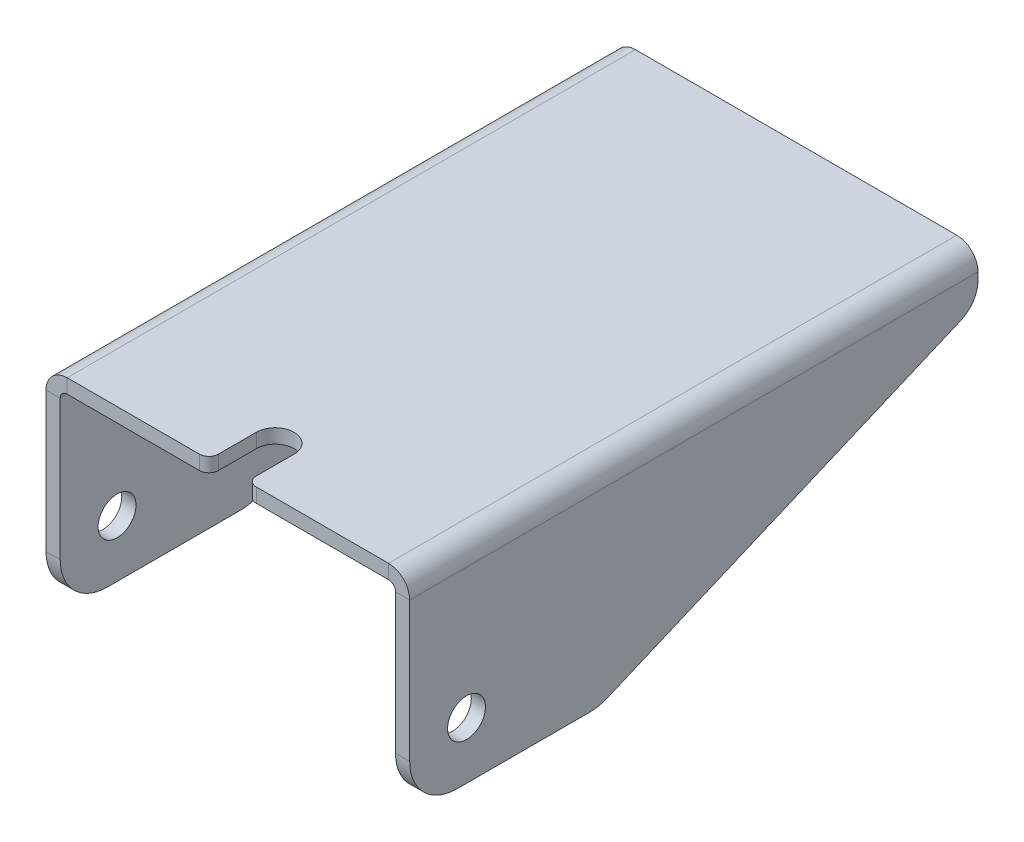
ISO-10303-21;
HEADER;
FILE_DESCRIPTION(('STEP AP214'),'2;1');
FILE_NAME('part.step','',(''),(''),'','','');
FILE_SCHEMA(('AUTOMOTIVE_DESIGN { 1 0 10303 214 1 1 1 1 }'));
ENDSEC;
DATA;
#1=APPLICATION_CONTEXT('core data for automotive mechanical design processes');
#2=APPLICATION_PROTOCOL_DEFINITION('international standard','automotive_design',2000,#1);
#3=PRODUCT_CONTEXT('',#1,'mechanical');
#4=PRODUCT('Part','Part','',(#3));
#5=PRODUCT_RELATED_PRODUCT_CATEGORY('part','',(#4));
#6=PRODUCT_DEFINITION_FORMATION('','',#4);
#7=PRODUCT_DEFINITION_CONTEXT('part definition',#1,'design');
#8=PRODUCT_DEFINITION('design','',#6,#7);
#9=PRODUCT_DEFINITION_SHAPE('','',#8);
#10=(LENGTH_UNIT() NAMED_UNIT(*) SI_UNIT(.MILLI.,.METRE.));
#11=(NAMED_UNIT(*) PLANE_ANGLE_UNIT() SI_UNIT($,.RADIAN.));
#12=(NAMED_UNIT(*) SI_UNIT($,.STERADIAN.) SOLID_ANGLE_UNIT());
#13=UNCERTAINTY_MEASURE_WITH_UNIT(LENGTH_MEASURE(1.E-05),#10,'distance_accuracy_value','');
#14=(GEOMETRIC_REPRESENTATION_CONTEXT(3) GLOBAL_UNCERTAINTY_ASSIGNED_CONTEXT((#13)) GLOBAL_UNIT_ASSIGNED_CONTEXT((#10,
#11,#12)) REPRESENTATION_CONTEXT('',''));
#15=CARTESIAN_POINT('',(0.,0.,0.));
#16=DIRECTION('',(0.,0.,1.));
#17=DIRECTION('',(1.,0.,0.));
#18=AXIS2_PLACEMENT_3D('',#15,#16,#17);
#19=CARTESIAN_POINT('',(-17.7,-1.5,60.));
#20=DIRECTION('',(0.,0.,1.));
#21=DIRECTION('',(1.,0.,0.));
#22=AXIS2_PLACEMENT_3D('',#19,#20,#21);
#23=PLANE('',#22);
#24=DIRECTION('',(1.,0.,0.));
#25=VECTOR('',#24,1.);
#26=CARTESIAN_POINT('',(-17.7,0.,60.));
#27=LINE('',#26,#25);
#28=CARTESIAN_POINT('',(2.99999999999999,0.,60.));
#29=VERTEX_POINT('',#28);
#30=CARTESIAN_POINT('',(16.9634,0.,60.));
#31=VERTEX_POINT('',#30);
#32=EDGE_CURVE('E412',#29,#31,#27,.T.);
#33=ORIENTED_EDGE('',*,*,#32,.F.);
#34=DIRECTION('',(0.,1.,0.));
#35=VECTOR('',#34,1.);
#36=CARTESIAN_POINT('',(2.99999999999999,-1.5,60.));
#37=LINE('',#36,#35);
#38=CARTESIAN_POINT('',(2.99999999999999,-1.5,60.));
#39=VERTEX_POINT('',#38);
#40=EDGE_CURVE('E11',#29,#39,#37,.F.);
#41=ORIENTED_EDGE('',*,*,#40,.T.);
#42=DIRECTION('',(1.,0.,0.));
#43=VECTOR('',#42,1.);
#44=CARTESIAN_POINT('',(-17.7,-1.5,60.));
#45=LINE('',#44,#43);
#46=CARTESIAN_POINT('',(16.9634,-1.5,60.));
#47=VERTEX_POINT('',#46);
#48=EDGE_CURVE('E404',#39,#47,#45,.T.);
#49=ORIENTED_EDGE('',*,*,#48,.T.);
#50=DIRECTION('',(0.,1.,0.));
#51=VECTOR('',#50,1.);
#52=CARTESIAN_POINT('',(16.9634,-1.5,60.));
#53=LINE('',#52,#51);
#54=EDGE_CURVE('E305',#47,#31,#53,.T.);
#55=ORIENTED_EDGE('',*,*,#54,.T.);
#56=EDGE_LOOP('',(#33,#41,#49,#55));
#57=FACE_BOUND('',#56,.T.);
#58=ADVANCED_FACE('F41',(#57),#23,.T.);
#59=CARTESIAN_POINT('',(-19.2000000000001,-22.,0.));
#60=DIRECTION('',(0.,0.,1.));
#61=DIRECTION('',(1.,0.,0.));
#62=AXIS2_PLACEMENT_3D('',#59,#60,#61);
#63=PLANE('',#62);
#64=DIRECTION('',(0.,-1.,0.));
#65=VECTOR('',#64,1.);
#66=CARTESIAN_POINT('',(-17.7000000000001,-22.,0.));
#67=LINE('',#66,#65);
#68=CARTESIAN_POINT('',(-17.7,-2.2366,0.));
#69=VERTEX_POINT('',#68);
#70=CARTESIAN_POINT('',(-17.7,-3.01530292818484,0.));
#71=VERTEX_POINT('',#70);
#72=EDGE_CURVE('E361',#69,#71,#67,.T.);
#73=ORIENTED_EDGE('',*,*,#72,.T.);
#74=DIRECTION('',(-1.,0.,0.));
#75=VECTOR('',#74,1.);
#76=CARTESIAN_POINT('',(-19.2,-3.01530292818482,0.));
#77=LINE('',#76,#75);
#78=CARTESIAN_POINT('',(-19.2,-3.01530292818483,0.));
#79=VERTEX_POINT('',#78);
#80=EDGE_CURVE('E432',#71,#79,#77,.T.);
#81=ORIENTED_EDGE('',*,*,#80,.T.);
#82=DIRECTION('',(0.,-1.,0.));
#83=VECTOR('',#82,1.);
#84=CARTESIAN_POINT('',(-19.2000000000001,-22.,0.));
#85=LINE('',#84,#83);
#86=CARTESIAN_POINT('',(-19.2,-2.23659999999999,0.));
#87=VERTEX_POINT('',#86);
#88=EDGE_CURVE('E362',#87,#79,#85,.T.);
#89=ORIENTED_EDGE('',*,*,#88,.F.);
#90=DIRECTION('',(-1.,0.,0.));
#91=VECTOR('',#90,1.);
#92=CARTESIAN_POINT('',(-17.7,-2.2366,0.));
#93=LINE('',#92,#91);
#94=EDGE_CURVE('E353',#69,#87,#93,.T.);
#95=ORIENTED_EDGE('',*,*,#94,.F.);
#96=EDGE_LOOP('',(#73,#81,#89,#95));
#97=FACE_BOUND('',#96,.T.);
#98=ADVANCED_FACE('F466',(#97),#63,.F.);
#99=CARTESIAN_POINT('',(-19.2,0.,0.));
#100=DIRECTION('',(1.,0.,0.));
#101=DIRECTION('',(0.,1.,0.));
#102=AXIS2_PLACEMENT_3D('',#99,#100,#101);
#103=PLANE('',#102);
#104=CARTESIAN_POINT('',(-19.2,-16.,54.));
#105=DIRECTION('',(-1.,0.,0.));
#106=DIRECTION('',(0.,-1.,0.));
#107=AXIS2_PLACEMENT_3D('',#104,#105,#106);
#108=CIRCLE('',#107,2.);
#109=CARTESIAN_POINT('',(-19.2,-18.,54.));
#110=VERTEX_POINT('',#109);
#111=EDGE_CURVE('E340',#110,#110,#108,.T.);
#112=ORIENTED_EDGE('',*,*,#111,.F.);
#113=EDGE_LOOP('',(#112));
#114=FACE_BOUND('',#113,.T.);
#115=ORIENTED_EDGE('',*,*,#88,.T.);
#116=CARTESIAN_POINT('',(-19.2,-3.01530292818483,3.));
#117=DIRECTION('',(1.,0.,0.));
#118=DIRECTION('',(0.,1.,0.));
#119=AXIS2_PLACEMENT_3D('',#116,#117,#118);
#120=CIRCLE('',#119,3.);
#121=CARTESIAN_POINT('',(-19.2,-5.77629568356025,1.82657807896544));
#122=VERTEX_POINT('',#121);
#123=EDGE_CURVE('E435',#79,#122,#120,.F.);
#124=ORIENTED_EDGE('',*,*,#123,.T.);
#125=DIRECTION('',(0.,-0.391140640344853,0.920330918458474));
#126=VECTOR('',#125,1.);
#127=CARTESIAN_POINT('',(-19.2,-4.99999999999993,0.));
#128=LINE('',#127,#126);
#129=CARTESIAN_POINT('',(-19.2000000000001,-21.6016545922924,39.0627166877468));
#130=VERTEX_POINT('',#129);
#131=EDGE_CURVE('E346',#122,#130,#128,.T.);
#132=ORIENTED_EDGE('',*,*,#131,.T.);
#133=CARTESIAN_POINT('',(-19.2,-17.,41.018419889471));
#134=DIRECTION('',(1.,0.,0.));
#135=DIRECTION('',(0.,1.,0.));
#136=AXIS2_PLACEMENT_3D('',#133,#134,#135);
#137=CIRCLE('',#136,5.);
#138=CARTESIAN_POINT('',(-19.2000000000001,-22.,41.018419889471));
#139=VERTEX_POINT('',#138);
#140=EDGE_CURVE('E418',#130,#139,#137,.F.);
#141=ORIENTED_EDGE('',*,*,#140,.T.);
#142=DIRECTION('',(0.,0.,1.));
#143=VECTOR('',#142,1.);
#144=CARTESIAN_POINT('',(-19.2000000000001,-22.,60.));
#145=LINE('',#144,#143);
#146=CARTESIAN_POINT('',(-19.2000000000001,-22.,55.));
#147=VERTEX_POINT('',#146);
#148=EDGE_CURVE('E365',#139,#147,#145,.T.);
#149=ORIENTED_EDGE('',*,*,#148,.T.);
#150=CARTESIAN_POINT('',(-19.2,-17.,55.));
#151=DIRECTION('',(1.,0.,0.));
#152=DIRECTION('',(0.,1.,0.));
#153=AXIS2_PLACEMENT_3D('',#150,#151,#152);
#154=CIRCLE('',#153,5.);
#155=CARTESIAN_POINT('',(-19.2,-17.,60.));
#156=VERTEX_POINT('',#155);
#157=EDGE_CURVE('E416',#147,#156,#154,.F.);
#158=ORIENTED_EDGE('',*,*,#157,.T.);
#159=DIRECTION('',(0.,1.,0.));
#160=VECTOR('',#159,1.);
#161=CARTESIAN_POINT('',(-19.2,-1.49999999999999,60.));
#162=LINE('',#161,#160);
#163=CARTESIAN_POINT('',(-19.2,-2.23659999999999,60.));
#164=VERTEX_POINT('',#163);
#165=EDGE_CURVE('E369',#156,#164,#162,.T.);
#166=ORIENTED_EDGE('',*,*,#165,.T.);
#167=DIRECTION('',(0.,0.,1.));
#168=VECTOR('',#167,1.);
#169=CARTESIAN_POINT('',(-19.2,-2.23659999999999,0.));
#170=LINE('',#169,#168);
#171=EDGE_CURVE('E356',#87,#164,#170,.T.);
#172=ORIENTED_EDGE('',*,*,#171,.F.);
#173=EDGE_LOOP('',(#115,#124,#132,#141,#149,#158,#166,#172));
#174=FACE_BOUND('',#173,.T.);
#175=ADVANCED_FACE('F472',(#114,#174),#103,.F.);
#176=CARTESIAN_POINT('',(-17.7,0.,0.));
#177=DIRECTION('',(1.,0.,0.));
#178=DIRECTION('',(0.,1.,0.));
#179=AXIS2_PLACEMENT_3D('',#176,#177,#178);
#180=PLANE('',#179);
#181=CARTESIAN_POINT('',(-17.7,-16.,54.));
#182=DIRECTION('',(1.,0.,0.));
#183=DIRECTION('',(0.,1.,0.));
#184=AXIS2_PLACEMENT_3D('',#181,#182,#183);
#185=CIRCLE('',#184,2.);
#186=CARTESIAN_POINT('',(-17.7,-14.,54.));
#187=VERTEX_POINT('',#186);
#188=EDGE_CURVE('E343',#187,#187,#185,.F.);
#189=ORIENTED_EDGE('',*,*,#188,.T.);
#190=EDGE_LOOP('',(#189));
#191=FACE_BOUND('',#190,.T.);
#192=DIRECTION('',(0.,-0.391140640344853,0.920330918458474));
#193=VECTOR('',#192,1.);
#194=CARTESIAN_POINT('',(-17.7,-4.99999999999994,0.));
#195=LINE('',#194,#193);
#196=CARTESIAN_POINT('',(-17.7,-5.77629568356025,1.82657807896544));
#197=VERTEX_POINT('',#196);
#198=CARTESIAN_POINT('',(-17.7000000000001,-21.6016545922924,39.0627166877468));
#199=VERTEX_POINT('',#198);
#200=EDGE_CURVE('E348',#197,#199,#195,.T.);
#201=ORIENTED_EDGE('',*,*,#200,.F.);
#202=CARTESIAN_POINT('',(-17.7,-3.01530292818483,3.));
#203=DIRECTION('',(1.,0.,0.));
#204=DIRECTION('',(0.,1.,0.));
#205=AXIS2_PLACEMENT_3D('',#202,#203,#204);
#206=CIRCLE('',#205,3.);
#207=EDGE_CURVE('E439',#197,#71,#206,.T.);
#208=ORIENTED_EDGE('',*,*,#207,.T.);
#209=ORIENTED_EDGE('',*,*,#72,.F.);
#210=DIRECTION('',(0.,0.,-1.));
#211=VECTOR('',#210,1.);
#212=CARTESIAN_POINT('',(-17.7,-2.2366,60.));
#213=LINE('',#212,#211);
#214=CARTESIAN_POINT('',(-17.7,-2.2366,60.));
#215=VERTEX_POINT('',#214);
#216=EDGE_CURVE('E351',#215,#69,#213,.T.);
#217=ORIENTED_EDGE('',*,*,#216,.F.);
#218=DIRECTION('',(0.,1.,0.));
#219=VECTOR('',#218,1.);
#220=CARTESIAN_POINT('',(-17.7,-1.5,60.));
#221=LINE('',#220,#219);
#222=CARTESIAN_POINT('',(-17.7,-17.,60.));
#223=VERTEX_POINT('',#222);
#224=EDGE_CURVE('E366',#223,#215,#221,.T.);
#225=ORIENTED_EDGE('',*,*,#224,.F.);
#226=CARTESIAN_POINT('',(-17.7,-17.,55.));
#227=DIRECTION('',(1.,0.,0.));
#228=DIRECTION('',(0.,1.,0.));
#229=AXIS2_PLACEMENT_3D('',#226,#227,#228);
#230=CIRCLE('',#229,5.);
#231=CARTESIAN_POINT('',(-17.7000000000001,-22.,55.));
#232=VERTEX_POINT('',#231);
#233=EDGE_CURVE('E424',#223,#232,#230,.T.);
#234=ORIENTED_EDGE('',*,*,#233,.T.);
#235=DIRECTION('',(0.,0.,1.));
#236=VECTOR('',#235,1.);
#237=CARTESIAN_POINT('',(-17.7000000000001,-22.,60.));
#238=LINE('',#237,#236);
#239=CARTESIAN_POINT('',(-17.7000000000001,-22.,41.018419889471));
#240=VERTEX_POINT('',#239);
#241=EDGE_CURVE('E374',#240,#232,#238,.T.);
#242=ORIENTED_EDGE('',*,*,#241,.F.);
#243=CARTESIAN_POINT('',(-17.7,-17.,41.018419889471));
#244=DIRECTION('',(1.,0.,0.));
#245=DIRECTION('',(0.,1.,0.));
#246=AXIS2_PLACEMENT_3D('',#243,#244,#245);
#247=CIRCLE('',#246,5.);
#248=EDGE_CURVE('E426',#240,#199,#247,.T.);
#249=ORIENTED_EDGE('',*,*,#248,.T.);
#250=EDGE_LOOP('',(#201,#208,#209,#217,#225,#234,#242,#249));
#251=FACE_BOUND('',#250,.T.);
#252=ADVANCED_FACE('F518',(#191,#251),#180,.T.);
#253=CARTESIAN_POINT('',(-19.2000000000001,-22.,60.));
#254=DIRECTION('',(0.,1.,0.));
#255=DIRECTION('',(-1.,0.,0.));
#256=AXIS2_PLACEMENT_3D('',#253,#254,#255);
#257=PLANE('',#256);
#258=ORIENTED_EDGE('',*,*,#148,.F.);
#259=DIRECTION('',(-1.,0.,0.));
#260=VECTOR('',#259,1.);
#261=CARTESIAN_POINT('',(-17.7000000000001,-22.,41.018419889471));
#262=LINE('',#261,#260);
#263=EDGE_CURVE('E422',#139,#240,#262,.F.);
#264=ORIENTED_EDGE('',*,*,#263,.T.);
#265=ORIENTED_EDGE('',*,*,#241,.T.);
#266=DIRECTION('',(1.,0.,0.));
#267=VECTOR('',#266,1.);
#268=CARTESIAN_POINT('',(-19.2000000000001,-22.,55.));
#269=LINE('',#268,#267);
#270=EDGE_CURVE('E420',#232,#147,#269,.F.);
#271=ORIENTED_EDGE('',*,*,#270,.T.);
#272=EDGE_LOOP('',(#258,#264,#265,#271));
#273=FACE_BOUND('',#272,.T.);
#274=ADVANCED_FACE('F501',(#273),#257,.F.);
#275=CARTESIAN_POINT('',(0.,-1.5,0.));
#276=DIRECTION('',(0.,0.,-1.));
#277=DIRECTION('',(-1.,0.,0.));
#278=AXIS2_PLACEMENT_3D('',#275,#276,#277);
#279=PLANE('',#278);
#280=DIRECTION('',(-1.,0.,0.));
#281=VECTOR('',#280,1.);
#282=CARTESIAN_POINT('',(0.,-1.5,0.));
#283=LINE('',#282,#281);
#284=CARTESIAN_POINT('',(16.9634,-1.5,0.));
#285=VERTEX_POINT('',#284);
#286=CARTESIAN_POINT('',(-16.9634,-1.5,0.));
#287=VERTEX_POINT('',#286);
#288=EDGE_CURVE('E401',#285,#287,#283,.T.);
#289=ORIENTED_EDGE('',*,*,#288,.T.);
#290=DIRECTION('',(0.,1.,0.));
#291=VECTOR('',#290,1.);
#292=CARTESIAN_POINT('',(-16.9634,-1.5,0.));
#293=LINE('',#292,#291);
#294=CARTESIAN_POINT('',(-16.9634,0.,0.));
#295=VERTEX_POINT('',#294);
#296=EDGE_CURVE('E385',#287,#295,#293,.T.);
#297=ORIENTED_EDGE('',*,*,#296,.T.);
#298=DIRECTION('',(-1.,0.,0.));
#299=VECTOR('',#298,1.);
#300=CARTESIAN_POINT('',(0.,0.,0.));
#301=LINE('',#300,#299);
#302=CARTESIAN_POINT('',(16.9634,0.,0.));
#303=VERTEX_POINT('',#302);
#304=EDGE_CURVE('E398',#303,#295,#301,.T.);
#305=ORIENTED_EDGE('',*,*,#304,.F.);
#306=DIRECTION('',(0.,1.,0.));
#307=VECTOR('',#306,1.);
#308=CARTESIAN_POINT('',(16.9634,-1.5,0.));
#309=LINE('',#308,#307);
#310=EDGE_CURVE('E295',#285,#303,#309,.T.);
#311=ORIENTED_EDGE('',*,*,#310,.F.);
#312=EDGE_LOOP('',(#289,#297,#305,#311));
#313=FACE_BOUND('',#312,.T.);
#314=ADVANCED_FACE('F496',(#313),#279,.T.);
#315=CARTESIAN_POINT('',(0.,-1.5,0.));
#316=DIRECTION('',(0.,1.,0.));
#317=DIRECTION('',(0.,0.,1.));
#318=AXIS2_PLACEMENT_3D('',#315,#316,#317);
#319=PLANE('',#318);
#320=DIRECTION('',(0.,0.,-1.));
#321=VECTOR('',#320,1.);
#322=CARTESIAN_POINT('',(-1.99999999999999,-1.5,55.));
#323=LINE('',#322,#321);
#324=CARTESIAN_POINT('',(-1.99999999999999,-1.5,59.));
#325=VERTEX_POINT('',#324);
#326=CARTESIAN_POINT('',(-1.99999999999999,-1.5,55.));
#327=VERTEX_POINT('',#326);
#328=EDGE_CURVE('E221',#325,#327,#323,.T.);
#329=ORIENTED_EDGE('',*,*,#328,.F.);
#330=CARTESIAN_POINT('',(-2.99999999999999,-1.5,59.));
#331=DIRECTION('',(0.,1.,0.));
#332=DIRECTION('',(0.,0.,1.));
#333=AXIS2_PLACEMENT_3D('',#330,#331,#332);
#334=CIRCLE('',#333,1.);
#335=CARTESIAN_POINT('',(-2.99999999999999,-1.5,60.));
#336=VERTEX_POINT('',#335);
#337=EDGE_CURVE('E450',#325,#336,#334,.F.);
#338=ORIENTED_EDGE('',*,*,#337,.T.);
#339=CARTESIAN_POINT('',(-16.9634,-1.5,60.));
#340=VERTEX_POINT('',#339);
#341=EDGE_CURVE('E406',#340,#336,#45,.T.);
#342=ORIENTED_EDGE('',*,*,#341,.F.);
#343=DIRECTION('',(0.,0.,-1.));
#344=VECTOR('',#343,1.);
#345=CARTESIAN_POINT('',(-16.9634,-1.5,0.));
#346=LINE('',#345,#344);
#347=EDGE_CURVE('E391',#287,#340,#346,.F.);
#348=ORIENTED_EDGE('',*,*,#347,.F.);
#349=ORIENTED_EDGE('',*,*,#288,.F.);
#350=DIRECTION('',(0.,0.,-1.));
#351=VECTOR('',#350,1.);
#352=CARTESIAN_POINT('',(16.9634,-1.5,0.));
#353=LINE('',#352,#351);
#354=EDGE_CURVE('E300',#285,#47,#353,.F.);
#355=ORIENTED_EDGE('',*,*,#354,.T.);
#356=ORIENTED_EDGE('',*,*,#48,.F.);
#357=CARTESIAN_POINT('',(2.99999999999999,-1.5,59.));
#358=DIRECTION('',(0.,1.,0.));
#359=DIRECTION('',(0.,0.,1.));
#360=AXIS2_PLACEMENT_3D('',#357,#358,#359);
#361=CIRCLE('',#360,1.);
#362=CARTESIAN_POINT('',(1.99999999999999,-1.5,59.));
#363=VERTEX_POINT('',#362);
#364=EDGE_CURVE('E56',#39,#363,#361,.F.);
#365=ORIENTED_EDGE('',*,*,#364,.T.);
#366=DIRECTION('',(0.,0.,1.));
#367=VECTOR('',#366,1.);
#368=CARTESIAN_POINT('',(1.99999999999999,-1.5,55.));
#369=LINE('',#368,#367);
#370=CARTESIAN_POINT('',(1.99999999999999,-1.5,55.));
#371=VERTEX_POINT('',#370);
#372=EDGE_CURVE('E242',#371,#363,#369,.T.);
#373=ORIENTED_EDGE('',*,*,#372,.F.);
#374=CARTESIAN_POINT('',(0.,-1.5,55.));
#375=DIRECTION('',(0.,1.,0.));
#376=DIRECTION('',(0.,0.,1.));
#377=AXIS2_PLACEMENT_3D('',#374,#375,#376);
#378=CIRCLE('',#377,1.99999999999999);
#379=EDGE_CURVE('E246',#327,#371,#378,.F.);
#380=ORIENTED_EDGE('',*,*,#379,.F.);
#381=EDGE_LOOP('',(#329,#338,#342,#348,#349,#355,#356,#365,#373,#380));
#382=FACE_BOUND('',#381,.T.);
#383=ADVANCED_FACE('F487',(#382),#319,.F.);
#384=CARTESIAN_POINT('',(0.,0.,0.));
#385=DIRECTION('',(0.,1.,0.));
#386=DIRECTION('',(0.,0.,1.));
#387=AXIS2_PLACEMENT_3D('',#384,#385,#386);
#388=PLANE('',#387);
#389=CARTESIAN_POINT('',(-16.9634,0.,60.));
#390=VERTEX_POINT('',#389);
#391=CARTESIAN_POINT('',(-2.99999999999999,0.,60.));
#392=VERTEX_POINT('',#391);
#393=EDGE_CURVE('E405',#390,#392,#27,.T.);
#394=ORIENTED_EDGE('',*,*,#393,.T.);
#395=CARTESIAN_POINT('',(-2.99999999999999,0.,59.));
#396=DIRECTION('',(0.,1.,0.));
#397=DIRECTION('',(0.,0.,1.));
#398=AXIS2_PLACEMENT_3D('',#395,#396,#397);
#399=CIRCLE('',#398,1.);
#400=CARTESIAN_POINT('',(-1.99999999999999,0.,59.));
#401=VERTEX_POINT('',#400);
#402=EDGE_CURVE('E237',#392,#401,#399,.T.);
#403=ORIENTED_EDGE('',*,*,#402,.T.);
#404=DIRECTION('',(0.,0.,1.));
#405=VECTOR('',#404,1.);
#406=CARTESIAN_POINT('',(-1.99999999999999,0.,55.));
#407=LINE('',#406,#405);
#408=CARTESIAN_POINT('',(-1.99999999999999,0.,55.));
#409=VERTEX_POINT('',#408);
#410=EDGE_CURVE('E218',#409,#401,#407,.T.);
#411=ORIENTED_EDGE('',*,*,#410,.F.);
#412=CARTESIAN_POINT('',(0.,0.,55.));
#413=DIRECTION('',(0.,1.,0.));
#414=DIRECTION('',(0.,0.,1.));
#415=AXIS2_PLACEMENT_3D('',#412,#413,#414);
#416=CIRCLE('',#415,1.99999999999999);
#417=CARTESIAN_POINT('',(1.99999999999999,0.,55.));
#418=VERTEX_POINT('',#417);
#419=EDGE_CURVE('E229',#418,#409,#416,.T.);
#420=ORIENTED_EDGE('',*,*,#419,.F.);
#421=DIRECTION('',(0.,0.,-1.));
#422=VECTOR('',#421,1.);
#423=CARTESIAN_POINT('',(1.99999999999999,0.,55.));
#424=LINE('',#423,#422);
#425=CARTESIAN_POINT('',(1.99999999999999,0.,59.));
#426=VERTEX_POINT('',#425);
#427=EDGE_CURVE('E225',#426,#418,#424,.T.);
#428=ORIENTED_EDGE('',*,*,#427,.F.);
#429=CARTESIAN_POINT('',(2.99999999999999,0.,59.));
#430=DIRECTION('',(0.,1.,0.));
#431=DIRECTION('',(0.,0.,1.));
#432=AXIS2_PLACEMENT_3D('',#429,#430,#431);
#433=CIRCLE('',#432,1.);
#434=EDGE_CURVE('E444',#426,#29,#433,.T.);
#435=ORIENTED_EDGE('',*,*,#434,.T.);
#436=ORIENTED_EDGE('',*,*,#32,.T.);
#437=DIRECTION('',(0.,0.,-1.));
#438=VECTOR('',#437,1.);
#439=CARTESIAN_POINT('',(16.9634,0.,0.));
#440=LINE('',#439,#438);
#441=EDGE_CURVE('E289',#303,#31,#440,.F.);
#442=ORIENTED_EDGE('',*,*,#441,.F.);
#443=ORIENTED_EDGE('',*,*,#304,.T.);
#444=DIRECTION('',(0.,0.,-1.));
#445=VECTOR('',#444,1.);
#446=CARTESIAN_POINT('',(-16.9634,0.,0.));
#447=LINE('',#446,#445);
#448=EDGE_CURVE('E378',#295,#390,#447,.F.);
#449=ORIENTED_EDGE('',*,*,#448,.T.);
#450=EDGE_LOOP('',(#394,#403,#411,#420,#428,#435,#436,#442,#443,#449));
#451=FACE_BOUND('',#450,.T.);
#452=ADVANCED_FACE('F236',(#451),#388,.T.);
#453=ORIENTED_EDGE('',*,*,#341,.T.);
#454=DIRECTION('',(0.,1.,0.));
#455=VECTOR('',#454,1.);
#456=CARTESIAN_POINT('',(-2.99999999999999,0.,60.));
#457=LINE('',#456,#455);
#458=EDGE_CURVE('E441',#336,#392,#457,.T.);
#459=ORIENTED_EDGE('',*,*,#458,.T.);
#460=ORIENTED_EDGE('',*,*,#393,.F.);
#461=DIRECTION('',(0.,1.,0.));
#462=VECTOR('',#461,1.);
#463=CARTESIAN_POINT('',(-16.9634,-1.5,60.));
#464=LINE('',#463,#462);
#465=EDGE_CURVE('E395',#340,#390,#464,.T.);
#466=ORIENTED_EDGE('',*,*,#465,.F.);
#467=EDGE_LOOP('',(#453,#459,#460,#466));
#468=FACE_BOUND('',#467,.T.);
#469=ADVANCED_FACE('F468',(#468),#23,.T.);
#470=CARTESIAN_POINT('',(-16.9634,-2.2366,60.));
#471=DIRECTION('',(0.,0.,1.));
#472=DIRECTION('',(1.,0.,0.));
#473=AXIS2_PLACEMENT_3D('',#470,#471,#472);
#474=PLANE('',#473);
#475=DIRECTION('',(-1.,0.,0.));
#476=VECTOR('',#475,1.);
#477=CARTESIAN_POINT('',(-17.7,-2.2366,60.));
#478=LINE('',#477,#476);
#479=EDGE_CURVE('E350',#215,#164,#478,.T.);
#480=ORIENTED_EDGE('',*,*,#479,.F.);
#481=CARTESIAN_POINT('',(-16.9634,-2.2366,60.));
#482=DIRECTION('',(0.,0.,-1.));
#483=DIRECTION('',(-1.,0.,0.));
#484=AXIS2_PLACEMENT_3D('',#481,#482,#483);
#485=CIRCLE('',#484,0.736599999999997);
#486=EDGE_CURVE('E388',#340,#215,#485,.F.);
#487=ORIENTED_EDGE('',*,*,#486,.F.);
#488=ORIENTED_EDGE('',*,*,#465,.T.);
#489=CARTESIAN_POINT('',(-16.9634,-2.2366,60.));
#490=DIRECTION('',(0.,0.,-1.));
#491=DIRECTION('',(-1.,0.,0.));
#492=AXIS2_PLACEMENT_3D('',#489,#490,#491);
#493=CIRCLE('',#492,2.2366);
#494=EDGE_CURVE('E381',#390,#164,#493,.F.);
#495=ORIENTED_EDGE('',*,*,#494,.T.);
#496=EDGE_LOOP('',(#480,#487,#488,#495));
#497=FACE_BOUND('',#496,.T.);
#498=ADVANCED_FACE('F478',(#497),#474,.T.);
#499=CARTESIAN_POINT('',(-16.9634,-2.2366,0.));
#500=DIRECTION('',(0.,0.,1.));
#501=DIRECTION('',(1.,0.,0.));
#502=AXIS2_PLACEMENT_3D('',#499,#500,#501);
#503=PLANE('',#502);
#504=CARTESIAN_POINT('',(-16.9634,-2.2366,0.));
#505=DIRECTION('',(0.,0.,-1.));
#506=DIRECTION('',(-1.,0.,0.));
#507=AXIS2_PLACEMENT_3D('',#504,#505,#506);
#508=CIRCLE('',#507,0.736599999999997);
#509=EDGE_CURVE('E371',#69,#287,#508,.T.);
#510=ORIENTED_EDGE('',*,*,#509,.F.);
#511=ORIENTED_EDGE('',*,*,#94,.T.);
#512=CARTESIAN_POINT('',(-16.9634,-2.2366,0.));
#513=DIRECTION('',(0.,0.,-1.));
#514=DIRECTION('',(-1.,0.,0.));
#515=AXIS2_PLACEMENT_3D('',#512,#513,#514);
#516=CIRCLE('',#515,2.2366);
#517=EDGE_CURVE('E382',#87,#295,#516,.T.);
#518=ORIENTED_EDGE('',*,*,#517,.T.);
#519=ORIENTED_EDGE('',*,*,#296,.F.);
#520=EDGE_LOOP('',(#510,#511,#518,#519));
#521=FACE_BOUND('',#520,.T.);
#522=ADVANCED_FACE('F484',(#521),#503,.F.);
#523=CARTESIAN_POINT('',(-16.9634,-2.2366,0.));
#524=DIRECTION('',(0.,0.,-1.));
#525=DIRECTION('',(-1.,0.,0.));
#526=AXIS2_PLACEMENT_3D('',#523,#524,#525);
#527=CYLINDRICAL_SURFACE('',#526,2.2366);
#528=ORIENTED_EDGE('',*,*,#448,.F.);
#529=ORIENTED_EDGE('',*,*,#517,.F.);
#530=ORIENTED_EDGE('',*,*,#171,.T.);
#531=ORIENTED_EDGE('',*,*,#494,.F.);
#532=EDGE_LOOP('',(#528,#529,#530,#531));
#533=FACE_BOUND('',#532,.T.);
#534=ADVANCED_FACE('F505',(#533),#527,.T.);
#535=CARTESIAN_POINT('',(-16.9634,-2.2366,0.));
#536=DIRECTION('',(0.,0.,-1.));
#537=DIRECTION('',(-1.,0.,0.));
#538=AXIS2_PLACEMENT_3D('',#535,#536,#537);
#539=CYLINDRICAL_SURFACE('',#538,0.736599999999997);
#540=ORIENTED_EDGE('',*,*,#347,.T.);
#541=ORIENTED_EDGE('',*,*,#486,.T.);
#542=ORIENTED_EDGE('',*,*,#216,.T.);
#543=ORIENTED_EDGE('',*,*,#509,.T.);
#544=EDGE_LOOP('',(#540,#541,#542,#543));
#545=FACE_BOUND('',#544,.T.);
#546=ADVANCED_FACE('F508',(#545),#539,.F.);
#547=CARTESIAN_POINT('',(-19.2,-1.49999999999999,60.));
#548=DIRECTION('',(0.,0.,-1.));
#549=DIRECTION('',(-1.,0.,0.));
#550=AXIS2_PLACEMENT_3D('',#547,#548,#549);
#551=PLANE('',#550);
#552=ORIENTED_EDGE('',*,*,#165,.F.);
#553=DIRECTION('',(1.,0.,0.));
#554=VECTOR('',#553,1.);
#555=CARTESIAN_POINT('',(-19.2,-17.,60.));
#556=LINE('',#555,#554);
#557=EDGE_CURVE('E429',#156,#223,#556,.T.);
#558=ORIENTED_EDGE('',*,*,#557,.T.);
#559=ORIENTED_EDGE('',*,*,#224,.T.);
#560=ORIENTED_EDGE('',*,*,#479,.T.);
#561=EDGE_LOOP('',(#552,#558,#559,#560));
#562=FACE_BOUND('',#561,.T.);
#563=ADVANCED_FACE('F511',(#562),#551,.F.);
#564=CARTESIAN_POINT('',(25.7626276242015,-5.00000000000009,0.));
#565=DIRECTION('',(0.,-0.920330918458474,-0.391140640344853));
#566=DIRECTION('',(0.,0.391140640344853,-0.920330918458474));
#567=AXIS2_PLACEMENT_3D('',#564,#565,#566);
#568=PLANE('',#567);
#569=ORIENTED_EDGE('',*,*,#131,.F.);
#570=DIRECTION('',(-1.,0.,0.));
#571=VECTOR('',#570,1.);
#572=CARTESIAN_POINT('',(-17.7,-5.77629568356025,1.82657807896544));
#573=LINE('',#572,#571);
#574=EDGE_CURVE('E437',#122,#197,#573,.F.);
#575=ORIENTED_EDGE('',*,*,#574,.T.);
#576=ORIENTED_EDGE('',*,*,#200,.T.);
#577=DIRECTION('',(-1.,0.,0.));
#578=VECTOR('',#577,1.);
#579=CARTESIAN_POINT('',(-19.2,-21.6016545922924,39.0627166877467));
#580=LINE('',#579,#578);
#581=EDGE_CURVE('E409',#199,#130,#580,.T.);
#582=ORIENTED_EDGE('',*,*,#581,.T.);
#583=EDGE_LOOP('',(#569,#575,#576,#582));
#584=FACE_BOUND('',#583,.T.);
#585=ADVANCED_FACE('F522',(#584),#568,.T.);
#586=CARTESIAN_POINT('',(25.7626276242014,-17.0000000000002,41.018419889471));
#587=DIRECTION('',(1.,0.,0.));
#588=DIRECTION('',(0.,1.,0.));
#589=AXIS2_PLACEMENT_3D('',#586,#587,#588);
#590=CYLINDRICAL_SURFACE('',#589,5.);
#591=ORIENTED_EDGE('',*,*,#248,.F.);
#592=ORIENTED_EDGE('',*,*,#263,.F.);
#593=ORIENTED_EDGE('',*,*,#140,.F.);
#594=ORIENTED_EDGE('',*,*,#581,.F.);
#595=EDGE_LOOP('',(#591,#592,#593,#594));
#596=FACE_BOUND('',#595,.T.);
#597=ADVANCED_FACE('F532',(#596),#590,.T.);
#598=CARTESIAN_POINT('',(-19.2,-17.,55.));
#599=DIRECTION('',(1.,0.,0.));
#600=DIRECTION('',(0.,1.,0.));
#601=AXIS2_PLACEMENT_3D('',#598,#599,#600);
#602=CYLINDRICAL_SURFACE('',#601,5.);
#603=ORIENTED_EDGE('',*,*,#157,.F.);
#604=ORIENTED_EDGE('',*,*,#270,.F.);
#605=ORIENTED_EDGE('',*,*,#233,.F.);
#606=ORIENTED_EDGE('',*,*,#557,.F.);
#607=EDGE_LOOP('',(#603,#604,#605,#606));
#608=FACE_BOUND('',#607,.T.);
#609=ADVANCED_FACE('F870',(#608),#602,.T.);
#610=CARTESIAN_POINT('',(-19.2,-3.01530292818483,3.));
#611=DIRECTION('',(1.,0.,0.));
#612=DIRECTION('',(0.,1.,0.));
#613=AXIS2_PLACEMENT_3D('',#610,#611,#612);
#614=CYLINDRICAL_SURFACE('',#613,3.);
#615=ORIENTED_EDGE('',*,*,#207,.F.);
#616=ORIENTED_EDGE('',*,*,#574,.F.);
#617=ORIENTED_EDGE('',*,*,#123,.F.);
#618=ORIENTED_EDGE('',*,*,#80,.F.);
#619=EDGE_LOOP('',(#615,#616,#617,#618));
#620=FACE_BOUND('',#619,.T.);
#621=ADVANCED_FACE('F538',(#620),#614,.T.);
#622=CARTESIAN_POINT('',(-12.0431457505077,-16.,54.));
#623=DIRECTION('',(-1.,0.,0.));
#624=DIRECTION('',(0.,-1.,0.));
#625=AXIS2_PLACEMENT_3D('',#622,#623,#624);
#626=CYLINDRICAL_SURFACE('',#625,2.);
#627=ORIENTED_EDGE('',*,*,#111,.T.);
#628=EDGE_LOOP('',(#627));
#629=FACE_BOUND('',#628,.T.);
#630=ORIENTED_EDGE('',*,*,#188,.F.);
#631=EDGE_LOOP('',(#630));
#632=FACE_BOUND('',#631,.T.);
#633=ADVANCED_FACE('F534',(#629,#632),#626,.F.);
#634=CARTESIAN_POINT('',(19.2000000000001,-22.,0.));
#635=DIRECTION('',(0.,0.,1.));
#636=DIRECTION('',(-1.,0.,0.));
#637=AXIS2_PLACEMENT_3D('',#634,#635,#636);
#638=PLANE('',#637);
#639=DIRECTION('',(0.,-1.,0.));
#640=VECTOR('',#639,1.);
#641=CARTESIAN_POINT('',(17.7000000000001,-22.,0.));
#642=LINE('',#641,#640);
#643=CARTESIAN_POINT('',(17.7,-2.2366,0.));
#644=VERTEX_POINT('',#643);
#645=CARTESIAN_POINT('',(17.7,-3.01530292818484,0.));
#646=VERTEX_POINT('',#645);
#647=EDGE_CURVE('E270',#644,#646,#642,.T.);
#648=ORIENTED_EDGE('',*,*,#647,.F.);
#649=DIRECTION('',(1.,0.,0.));
#650=VECTOR('',#649,1.);
#651=CARTESIAN_POINT('',(17.7,-2.2366,0.));
#652=LINE('',#651,#650);
#653=CARTESIAN_POINT('',(19.2,-2.23659999999999,0.));
#654=VERTEX_POINT('',#653);
#655=EDGE_CURVE('E262',#644,#654,#652,.T.);
#656=ORIENTED_EDGE('',*,*,#655,.T.);
#657=DIRECTION('',(0.,-1.,0.));
#658=VECTOR('',#657,1.);
#659=CARTESIAN_POINT('',(19.2000000000001,-22.,0.));
#660=LINE('',#659,#658);
#661=CARTESIAN_POINT('',(19.2,-3.01530292818483,0.));
#662=VERTEX_POINT('',#661);
#663=EDGE_CURVE('E271',#654,#662,#660,.T.);
#664=ORIENTED_EDGE('',*,*,#663,.T.);
#665=DIRECTION('',(1.,0.,0.));
#666=VECTOR('',#665,1.);
#667=CARTESIAN_POINT('',(19.2,-3.01530292818482,0.));
#668=LINE('',#667,#666);
#669=EDGE_CURVE('E330',#646,#662,#668,.T.);
#670=ORIENTED_EDGE('',*,*,#669,.F.);
#671=EDGE_LOOP('',(#648,#656,#664,#670));
#672=FACE_BOUND('',#671,.T.);
#673=ADVANCED_FACE('F537',(#672),#638,.F.);
#674=CARTESIAN_POINT('',(19.2,0.,0.));
#675=DIRECTION('',(-1.,0.,0.));
#676=DIRECTION('',(0.,1.,0.));
#677=AXIS2_PLACEMENT_3D('',#674,#675,#676);
#678=PLANE('',#677);
#679=CARTESIAN_POINT('',(19.2,-16.,54.));
#680=DIRECTION('',(-1.,0.,0.));
#681=DIRECTION('',(0.,-1.,0.));
#682=AXIS2_PLACEMENT_3D('',#679,#680,#681);
#683=CIRCLE('',#682,2.);
#684=CARTESIAN_POINT('',(19.2,-18.,54.));
#685=VERTEX_POINT('',#684);
#686=EDGE_CURVE('E245',#685,#685,#683,.T.);
#687=ORIENTED_EDGE('',*,*,#686,.T.);
#688=EDGE_LOOP('',(#687));
#689=FACE_BOUND('',#688,.T.);
#690=ORIENTED_EDGE('',*,*,#663,.F.);
#691=DIRECTION('',(0.,0.,1.));
#692=VECTOR('',#691,1.);
#693=CARTESIAN_POINT('',(19.2,-2.23659999999999,0.));
#694=LINE('',#693,#692);
#695=CARTESIAN_POINT('',(19.2,-2.23659999999999,60.));
#696=VERTEX_POINT('',#695);
#697=EDGE_CURVE('E265',#654,#696,#694,.T.);
#698=ORIENTED_EDGE('',*,*,#697,.T.);
#699=DIRECTION('',(0.,1.,0.));
#700=VECTOR('',#699,1.);
#701=CARTESIAN_POINT('',(19.2,-1.49999999999999,60.));
#702=LINE('',#701,#700);
#703=CARTESIAN_POINT('',(19.2,-17.,60.));
#704=VERTEX_POINT('',#703);
#705=EDGE_CURVE('E278',#704,#696,#702,.T.);
#706=ORIENTED_EDGE('',*,*,#705,.F.);
#707=CARTESIAN_POINT('',(19.2,-17.,55.));
#708=DIRECTION('',(1.,0.,0.));
#709=DIRECTION('',(0.,1.,0.));
#710=AXIS2_PLACEMENT_3D('',#707,#708,#709);
#711=CIRCLE('',#710,5.);
#712=CARTESIAN_POINT('',(19.2000000000001,-22.,55.));
#713=VERTEX_POINT('',#712);
#714=EDGE_CURVE('E312',#713,#704,#711,.F.);
#715=ORIENTED_EDGE('',*,*,#714,.F.);
#716=DIRECTION('',(0.,0.,1.));
#717=VECTOR('',#716,1.);
#718=CARTESIAN_POINT('',(19.2000000000001,-22.,60.));
#719=LINE('',#718,#717);
#720=CARTESIAN_POINT('',(19.2000000000001,-22.,41.018419889471));
#721=VERTEX_POINT('',#720);
#722=EDGE_CURVE('E274',#721,#713,#719,.T.);
#723=ORIENTED_EDGE('',*,*,#722,.F.);
#724=CARTESIAN_POINT('',(19.2,-17.,41.018419889471));
#725=DIRECTION('',(1.,0.,0.));
#726=DIRECTION('',(0.,1.,0.));
#727=AXIS2_PLACEMENT_3D('',#724,#725,#726);
#728=CIRCLE('',#727,5.);
#729=CARTESIAN_POINT('',(19.2000000000001,-21.6016545922924,39.0627166877468));
#730=VERTEX_POINT('',#729);
#731=EDGE_CURVE('E315',#730,#721,#728,.F.);
#732=ORIENTED_EDGE('',*,*,#731,.F.);
#733=DIRECTION('',(0.,-0.391140640344853,0.920330918458474));
#734=VECTOR('',#733,1.);
#735=CARTESIAN_POINT('',(19.2,-4.99999999999993,0.));
#736=LINE('',#735,#734);
#737=CARTESIAN_POINT('',(19.2,-5.77629568356025,1.82657807896544));
#738=VERTEX_POINT('',#737);
#739=EDGE_CURVE('E252',#738,#730,#736,.T.);
#740=ORIENTED_EDGE('',*,*,#739,.F.);
#741=CARTESIAN_POINT('',(19.2,-3.01530292818483,3.));
#742=DIRECTION('',(1.,0.,0.));
#743=DIRECTION('',(0.,1.,0.));
#744=AXIS2_PLACEMENT_3D('',#741,#742,#743);
#745=CIRCLE('',#744,3.);
#746=EDGE_CURVE('E333',#662,#738,#745,.F.);
#747=ORIENTED_EDGE('',*,*,#746,.F.);
#748=EDGE_LOOP('',(#690,#698,#706,#715,#723,#732,#740,#747));
#749=FACE_BOUND('',#748,.T.);
#750=ADVANCED_FACE('F574',(#689,#749),#678,.F.);
#751=CARTESIAN_POINT('',(17.7,0.,0.));
#752=DIRECTION('',(-1.,0.,0.));
#753=DIRECTION('',(0.,1.,0.));
#754=AXIS2_PLACEMENT_3D('',#751,#752,#753);
#755=PLANE('',#754);
#756=CARTESIAN_POINT('',(17.7,-16.,54.));
#757=DIRECTION('',(1.,0.,0.));
#758=DIRECTION('',(0.,1.,0.));
#759=AXIS2_PLACEMENT_3D('',#756,#757,#758);
#760=CIRCLE('',#759,2.);
#761=CARTESIAN_POINT('',(17.7,-14.,54.));
#762=VERTEX_POINT('',#761);
#763=EDGE_CURVE('E249',#762,#762,#760,.F.);
#764=ORIENTED_EDGE('',*,*,#763,.F.);
#765=EDGE_LOOP('',(#764));
#766=FACE_BOUND('',#765,.T.);
#767=DIRECTION('',(0.,-0.391140640344853,0.920330918458474));
#768=VECTOR('',#767,1.);
#769=CARTESIAN_POINT('',(17.7,-4.99999999999994,0.));
#770=LINE('',#769,#768);
#771=CARTESIAN_POINT('',(17.7,-5.77629568356025,1.82657807896544));
#772=VERTEX_POINT('',#771);
#773=CARTESIAN_POINT('',(17.7000000000001,-21.6016545922924,39.0627166877468));
#774=VERTEX_POINT('',#773);
#775=EDGE_CURVE('E255',#772,#774,#770,.T.);
#776=ORIENTED_EDGE('',*,*,#775,.T.);
#777=CARTESIAN_POINT('',(17.7,-17.,41.018419889471));
#778=DIRECTION('',(1.,0.,0.));
#779=DIRECTION('',(0.,1.,0.));
#780=AXIS2_PLACEMENT_3D('',#777,#778,#779);
#781=CIRCLE('',#780,5.);
#782=CARTESIAN_POINT('',(17.7000000000001,-22.,41.018419889471));
#783=VERTEX_POINT('',#782);
#784=EDGE_CURVE('E325',#783,#774,#781,.T.);
#785=ORIENTED_EDGE('',*,*,#784,.F.);
#786=DIRECTION('',(0.,0.,1.));
#787=VECTOR('',#786,1.);
#788=CARTESIAN_POINT('',(17.7000000000001,-22.,60.));
#789=LINE('',#788,#787);
#790=CARTESIAN_POINT('',(17.7000000000001,-22.,55.));
#791=VERTEX_POINT('',#790);
#792=EDGE_CURVE('E284',#783,#791,#789,.T.);
#793=ORIENTED_EDGE('',*,*,#792,.T.);
#794=CARTESIAN_POINT('',(17.7,-17.,55.));
#795=DIRECTION('',(1.,0.,0.));
#796=DIRECTION('',(0.,1.,0.));
#797=AXIS2_PLACEMENT_3D('',#794,#795,#796);
#798=CIRCLE('',#797,5.);
#799=CARTESIAN_POINT('',(17.7,-17.,60.));
#800=VERTEX_POINT('',#799);
#801=EDGE_CURVE('E322',#800,#791,#798,.T.);
#802=ORIENTED_EDGE('',*,*,#801,.F.);
#803=DIRECTION('',(0.,1.,0.));
#804=VECTOR('',#803,1.);
#805=CARTESIAN_POINT('',(17.7,-1.5,60.));
#806=LINE('',#805,#804);
#807=CARTESIAN_POINT('',(17.7,-2.2366,60.));
#808=VERTEX_POINT('',#807);
#809=EDGE_CURVE('E275',#800,#808,#806,.T.);
#810=ORIENTED_EDGE('',*,*,#809,.T.);
#811=DIRECTION('',(0.,0.,-1.));
#812=VECTOR('',#811,1.);
#813=CARTESIAN_POINT('',(17.7,-2.2366,60.));
#814=LINE('',#813,#812);
#815=EDGE_CURVE('E259',#808,#644,#814,.T.);
#816=ORIENTED_EDGE('',*,*,#815,.T.);
#817=ORIENTED_EDGE('',*,*,#647,.T.);
#818=CARTESIAN_POINT('',(17.7,-3.01530292818483,3.));
#819=DIRECTION('',(1.,0.,0.));
#820=DIRECTION('',(0.,1.,0.));
#821=AXIS2_PLACEMENT_3D('',#818,#819,#820);
#822=CIRCLE('',#821,3.);
#823=EDGE_CURVE('E338',#772,#646,#822,.T.);
#824=ORIENTED_EDGE('',*,*,#823,.F.);
#825=EDGE_LOOP('',(#776,#785,#793,#802,#810,#816,#817,#824));
#826=FACE_BOUND('',#825,.T.);
#827=ADVANCED_FACE('F578',(#766,#826),#755,.T.);
#828=CARTESIAN_POINT('',(19.2000000000001,-22.,60.));
#829=DIRECTION('',(0.,1.,0.));
#830=DIRECTION('',(1.,0.,0.));
#831=AXIS2_PLACEMENT_3D('',#828,#829,#830);
#832=PLANE('',#831);
#833=ORIENTED_EDGE('',*,*,#722,.T.);
#834=DIRECTION('',(-1.,0.,0.));
#835=VECTOR('',#834,1.);
#836=CARTESIAN_POINT('',(19.2000000000001,-22.,55.));
#837=LINE('',#836,#835);
#838=EDGE_CURVE('E318',#791,#713,#837,.F.);
#839=ORIENTED_EDGE('',*,*,#838,.F.);
#840=ORIENTED_EDGE('',*,*,#792,.F.);
#841=DIRECTION('',(1.,0.,0.));
#842=VECTOR('',#841,1.);
#843=CARTESIAN_POINT('',(17.7000000000001,-22.,41.018419889471));
#844=LINE('',#843,#842);
#845=EDGE_CURVE('E320',#721,#783,#844,.F.);
#846=ORIENTED_EDGE('',*,*,#845,.F.);
#847=EDGE_LOOP('',(#833,#839,#840,#846));
#848=FACE_BOUND('',#847,.T.);
#849=ADVANCED_FACE('F562',(#848),#832,.F.);
#850=CARTESIAN_POINT('',(16.9634,-2.2366,60.));
#851=DIRECTION('',(0.,0.,1.));
#852=DIRECTION('',(-1.,0.,0.));
#853=AXIS2_PLACEMENT_3D('',#850,#851,#852);
#854=PLANE('',#853);
#855=DIRECTION('',(1.,0.,0.));
#856=VECTOR('',#855,1.);
#857=CARTESIAN_POINT('',(17.7,-2.2366,60.));
#858=LINE('',#857,#856);
#859=EDGE_CURVE('E258',#808,#696,#858,.T.);
#860=ORIENTED_EDGE('',*,*,#859,.T.);
#861=CARTESIAN_POINT('',(16.9634,-2.2366,60.));
#862=DIRECTION('',(0.,0.,1.));
#863=DIRECTION('',(1.,0.,0.));
#864=AXIS2_PLACEMENT_3D('',#861,#862,#863);
#865=CIRCLE('',#864,2.2366);
#866=EDGE_CURVE('E292',#31,#696,#865,.F.);
#867=ORIENTED_EDGE('',*,*,#866,.F.);
#868=ORIENTED_EDGE('',*,*,#54,.F.);
#869=CARTESIAN_POINT('',(16.9634,-2.2366,60.));
#870=DIRECTION('',(0.,0.,1.));
#871=DIRECTION('',(1.,0.,0.));
#872=AXIS2_PLACEMENT_3D('',#869,#870,#871);
#873=CIRCLE('',#872,0.736599999999997);
#874=EDGE_CURVE('E298',#47,#808,#873,.F.);
#875=ORIENTED_EDGE('',*,*,#874,.T.);
#876=EDGE_LOOP('',(#860,#867,#868,#875));
#877=FACE_BOUND('',#876,.T.);
#878=ADVANCED_FACE('F558',(#877),#854,.T.);
#879=CARTESIAN_POINT('',(16.9634,-2.2366,0.));
#880=DIRECTION('',(0.,0.,1.));
#881=DIRECTION('',(-1.,0.,0.));
#882=AXIS2_PLACEMENT_3D('',#879,#880,#881);
#883=PLANE('',#882);
#884=CARTESIAN_POINT('',(16.9634,-2.2366,0.));
#885=DIRECTION('',(0.,0.,1.));
#886=DIRECTION('',(1.,0.,0.));
#887=AXIS2_PLACEMENT_3D('',#884,#885,#886);
#888=CIRCLE('',#887,0.736599999999997);
#889=EDGE_CURVE('E281',#644,#285,#888,.T.);
#890=ORIENTED_EDGE('',*,*,#889,.T.);
#891=ORIENTED_EDGE('',*,*,#310,.T.);
#892=CARTESIAN_POINT('',(16.9634,-2.2366,0.));
#893=DIRECTION('',(0.,0.,1.));
#894=DIRECTION('',(1.,0.,0.));
#895=AXIS2_PLACEMENT_3D('',#892,#893,#894);
#896=CIRCLE('',#895,2.2366);
#897=EDGE_CURVE('E293',#654,#303,#896,.T.);
#898=ORIENTED_EDGE('',*,*,#897,.F.);
#899=ORIENTED_EDGE('',*,*,#655,.F.);
#900=EDGE_LOOP('',(#890,#891,#898,#899));
#901=FACE_BOUND('',#900,.T.);
#902=ADVANCED_FACE('F554',(#901),#883,.F.);
#903=CARTESIAN_POINT('',(16.9634,-2.2366,0.));
#904=DIRECTION('',(0.,0.,-1.));
#905=DIRECTION('',(1.,0.,0.));
#906=AXIS2_PLACEMENT_3D('',#903,#904,#905);
#907=CYLINDRICAL_SURFACE('',#906,2.2366);
#908=ORIENTED_EDGE('',*,*,#441,.T.);
#909=ORIENTED_EDGE('',*,*,#866,.T.);
#910=ORIENTED_EDGE('',*,*,#697,.F.);
#911=ORIENTED_EDGE('',*,*,#897,.T.);
#912=EDGE_LOOP('',(#908,#909,#910,#911));
#913=FACE_BOUND('',#912,.T.);
#914=ADVANCED_FACE('F557',(#913),#907,.T.);
#915=CARTESIAN_POINT('',(16.9634,-2.2366,0.));
#916=DIRECTION('',(0.,0.,-1.));
#917=DIRECTION('',(1.,0.,0.));
#918=AXIS2_PLACEMENT_3D('',#915,#916,#917);
#919=CYLINDRICAL_SURFACE('',#918,0.736599999999997);
#920=ORIENTED_EDGE('',*,*,#354,.F.);
#921=ORIENTED_EDGE('',*,*,#889,.F.);
#922=ORIENTED_EDGE('',*,*,#815,.F.);
#923=ORIENTED_EDGE('',*,*,#874,.F.);
#924=EDGE_LOOP('',(#920,#921,#922,#923));
#925=FACE_BOUND('',#924,.T.);
#926=ADVANCED_FACE('F564',(#925),#919,.F.);
#927=CARTESIAN_POINT('',(19.2,-1.49999999999999,60.));
#928=DIRECTION('',(0.,0.,-1.));
#929=DIRECTION('',(1.,0.,0.));
#930=AXIS2_PLACEMENT_3D('',#927,#928,#929);
#931=PLANE('',#930);
#932=ORIENTED_EDGE('',*,*,#705,.T.);
#933=ORIENTED_EDGE('',*,*,#859,.F.);
#934=ORIENTED_EDGE('',*,*,#809,.F.);
#935=DIRECTION('',(-1.,0.,0.));
#936=VECTOR('',#935,1.);
#937=CARTESIAN_POINT('',(19.2,-17.,60.));
#938=LINE('',#937,#936);
#939=EDGE_CURVE('E328',#704,#800,#938,.T.);
#940=ORIENTED_EDGE('',*,*,#939,.F.);
#941=EDGE_LOOP('',(#932,#933,#934,#940));
#942=FACE_BOUND('',#941,.T.);
#943=ADVANCED_FACE('F567',(#942),#931,.F.);
#944=CARTESIAN_POINT('',(-25.7626276242015,-5.00000000000009,0.));
#945=DIRECTION('',(0.,-0.920330918458474,-0.391140640344853));
#946=DIRECTION('',(0.,0.391140640344853,-0.920330918458474));
#947=AXIS2_PLACEMENT_3D('',#944,#945,#946);
#948=PLANE('',#947);
#949=ORIENTED_EDGE('',*,*,#739,.T.);
#950=DIRECTION('',(1.,0.,0.));
#951=VECTOR('',#950,1.);
#952=CARTESIAN_POINT('',(19.2,-21.6016545922924,39.0627166877467));
#953=LINE('',#952,#951);
#954=EDGE_CURVE('E308',#774,#730,#953,.T.);
#955=ORIENTED_EDGE('',*,*,#954,.F.);
#956=ORIENTED_EDGE('',*,*,#775,.F.);
#957=DIRECTION('',(1.,0.,0.));
#958=VECTOR('',#957,1.);
#959=CARTESIAN_POINT('',(17.7,-5.77629568356025,1.82657807896544));
#960=LINE('',#959,#958);
#961=EDGE_CURVE('E336',#738,#772,#960,.F.);
#962=ORIENTED_EDGE('',*,*,#961,.F.);
#963=EDGE_LOOP('',(#949,#955,#956,#962));
#964=FACE_BOUND('',#963,.T.);
#965=ADVANCED_FACE('F552',(#964),#948,.T.);
#966=CARTESIAN_POINT('',(-25.7626276242014,-17.0000000000002,41.018419889471));
#967=DIRECTION('',(-1.,0.,0.));
#968=DIRECTION('',(0.,1.,0.));
#969=AXIS2_PLACEMENT_3D('',#966,#967,#968);
#970=CYLINDRICAL_SURFACE('',#969,5.);
#971=ORIENTED_EDGE('',*,*,#784,.T.);
#972=ORIENTED_EDGE('',*,*,#954,.T.);
#973=ORIENTED_EDGE('',*,*,#731,.T.);
#974=ORIENTED_EDGE('',*,*,#845,.T.);
#975=EDGE_LOOP('',(#971,#972,#973,#974));
#976=FACE_BOUND('',#975,.T.);
#977=ADVANCED_FACE('F548',(#976),#970,.T.);
#978=CARTESIAN_POINT('',(19.2,-17.,55.));
#979=DIRECTION('',(-1.,0.,0.));
#980=DIRECTION('',(0.,1.,0.));
#981=AXIS2_PLACEMENT_3D('',#978,#979,#980);
#982=CYLINDRICAL_SURFACE('',#981,5.);
#983=ORIENTED_EDGE('',*,*,#714,.T.);
#984=ORIENTED_EDGE('',*,*,#939,.T.);
#985=ORIENTED_EDGE('',*,*,#801,.T.);
#986=ORIENTED_EDGE('',*,*,#838,.T.);
#987=EDGE_LOOP('',(#983,#984,#985,#986));
#988=FACE_BOUND('',#987,.T.);
#989=ADVANCED_FACE('F544',(#988),#982,.T.);
#990=CARTESIAN_POINT('',(19.2,-3.01530292818483,3.));
#991=DIRECTION('',(-1.,0.,0.));
#992=DIRECTION('',(0.,1.,0.));
#993=AXIS2_PLACEMENT_3D('',#990,#991,#992);
#994=CYLINDRICAL_SURFACE('',#993,3.);
#995=ORIENTED_EDGE('',*,*,#823,.T.);
#996=ORIENTED_EDGE('',*,*,#669,.T.);
#997=ORIENTED_EDGE('',*,*,#746,.T.);
#998=ORIENTED_EDGE('',*,*,#961,.T.);
#999=EDGE_LOOP('',(#995,#996,#997,#998));
#1000=FACE_BOUND('',#999,.T.);
#1001=ADVANCED_FACE('F540',(#1000),#994,.T.);
#1002=CARTESIAN_POINT('',(12.0431457505077,-16.,54.));
#1003=DIRECTION('',(1.,0.,0.));
#1004=DIRECTION('',(0.,-1.,0.));
#1005=AXIS2_PLACEMENT_3D('',#1002,#1003,#1004);
#1006=CYLINDRICAL_SURFACE('',#1005,2.);
#1007=ORIENTED_EDGE('',*,*,#686,.F.);
#1008=EDGE_LOOP('',(#1007));
#1009=FACE_BOUND('',#1008,.T.);
#1010=ORIENTED_EDGE('',*,*,#763,.T.);
#1011=EDGE_LOOP('',(#1010));
#1012=FACE_BOUND('',#1011,.T.);
#1013=ADVANCED_FACE('F543',(#1009,#1012),#1006,.F.);
#1014=CARTESIAN_POINT('',(0.,-9.56225774829854,55.));
#1015=DIRECTION('',(0.,1.,0.));
#1016=DIRECTION('',(0.,0.,1.));
#1017=AXIS2_PLACEMENT_3D('',#1014,#1015,#1016);
#1018=CYLINDRICAL_SURFACE('',#1017,1.99999999999999);
#1019=ORIENTED_EDGE('',*,*,#379,.T.);
#1020=DIRECTION('',(0.,1.,0.));
#1021=VECTOR('',#1020,1.);
#1022=CARTESIAN_POINT('',(1.99999999999999,-9.56225774829854,55.));
#1023=LINE('',#1022,#1021);
#1024=EDGE_CURVE('E224',#371,#418,#1023,.T.);
#1025=ORIENTED_EDGE('',*,*,#1024,.T.);
#1026=ORIENTED_EDGE('',*,*,#419,.T.);
#1027=DIRECTION('',(0.,1.,0.));
#1028=VECTOR('',#1027,1.);
#1029=CARTESIAN_POINT('',(-1.99999999999999,-9.56225774829854,55.));
#1030=LINE('',#1029,#1028);
#1031=EDGE_CURVE('E214',#327,#409,#1030,.T.);
#1032=ORIENTED_EDGE('',*,*,#1031,.F.);
#1033=EDGE_LOOP('',(#1019,#1025,#1026,#1032));
#1034=FACE_BOUND('',#1033,.T.);
#1035=ADVANCED_FACE('F230',(#1034),#1018,.F.);
#1036=CARTESIAN_POINT('',(1.99999999999999,-9.56225774829854,55.));
#1037=DIRECTION('',(1.,0.,0.));
#1038=DIRECTION('',(0.,0.,-1.));
#1039=AXIS2_PLACEMENT_3D('',#1036,#1037,#1038);
#1040=PLANE('',#1039);
#1041=ORIENTED_EDGE('',*,*,#372,.T.);
#1042=DIRECTION('',(0.,1.,0.));
#1043=VECTOR('',#1042,1.);
#1044=CARTESIAN_POINT('',(1.99999999999999,0.,59.));
#1045=LINE('',#1044,#1043);
#1046=EDGE_CURVE('E49',#363,#426,#1045,.T.);
#1047=ORIENTED_EDGE('',*,*,#1046,.T.);
#1048=ORIENTED_EDGE('',*,*,#427,.T.);
#1049=ORIENTED_EDGE('',*,*,#1024,.F.);
#1050=EDGE_LOOP('',(#1041,#1047,#1048,#1049));
#1051=FACE_BOUND('',#1050,.T.);
#1052=ADVANCED_FACE('F454',(#1051),#1040,.F.);
#1053=CARTESIAN_POINT('',(-1.99999999999999,-9.56225774829854,55.));
#1054=DIRECTION('',(-1.,0.,0.));
#1055=DIRECTION('',(0.,0.,1.));
#1056=AXIS2_PLACEMENT_3D('',#1053,#1054,#1055);
#1057=PLANE('',#1056);
#1058=ORIENTED_EDGE('',*,*,#410,.T.);
#1059=DIRECTION('',(0.,1.,0.));
#1060=VECTOR('',#1059,1.);
#1061=CARTESIAN_POINT('',(-1.99999999999999,-1.5,59.));
#1062=LINE('',#1061,#1060);
#1063=EDGE_CURVE('E447',#401,#325,#1062,.F.);
#1064=ORIENTED_EDGE('',*,*,#1063,.T.);
#1065=ORIENTED_EDGE('',*,*,#328,.T.);
#1066=ORIENTED_EDGE('',*,*,#1031,.T.);
#1067=EDGE_LOOP('',(#1058,#1064,#1065,#1066));
#1068=FACE_BOUND('',#1067,.T.);
#1069=ADVANCED_FACE('F216',(#1068),#1057,.F.);
#1070=CARTESIAN_POINT('',(-2.99999999999999,-1.5,59.));
#1071=DIRECTION('',(0.,-1.,0.));
#1072=DIRECTION('',(0.,0.,-1.));
#1073=AXIS2_PLACEMENT_3D('',#1070,#1071,#1072);
#1074=CYLINDRICAL_SURFACE('',#1073,1.);
#1075=ORIENTED_EDGE('',*,*,#337,.F.);
#1076=ORIENTED_EDGE('',*,*,#1063,.F.);
#1077=ORIENTED_EDGE('',*,*,#402,.F.);
#1078=ORIENTED_EDGE('',*,*,#458,.F.);
#1079=EDGE_LOOP('',(#1075,#1076,#1077,#1078));
#1080=FACE_BOUND('',#1079,.T.);
#1081=ADVANCED_FACE('F460',(#1080),#1074,.T.);
#1082=CARTESIAN_POINT('',(2.99999999999999,-9.56225774829854,59.));
#1083=DIRECTION('',(0.,-1.,0.));
#1084=DIRECTION('',(0.,0.,-1.));
#1085=AXIS2_PLACEMENT_3D('',#1082,#1083,#1084);
#1086=CYLINDRICAL_SURFACE('',#1085,1.);
#1087=ORIENTED_EDGE('',*,*,#364,.F.);
#1088=ORIENTED_EDGE('',*,*,#40,.F.);
#1089=ORIENTED_EDGE('',*,*,#434,.F.);
#1090=ORIENTED_EDGE('',*,*,#1046,.F.);
#1091=EDGE_LOOP('',(#1087,#1088,#1089,#1090));
#1092=FACE_BOUND('',#1091,.T.);
#1093=ADVANCED_FACE('F43',(#1092),#1086,.T.);
#1094=CLOSED_SHELL('',(#58,#98,#175,#252,#274,#314,#383,#452,#469,#498,#522,#534,#546,#563,#585,
#597,#609,#621,#633,#673,#750,#827,#849,#878,#902,#914,#926,#943,#965,#977,#989,#1001,#1013,
#1035,#1052,#1069,#1081,#1093));
#1095=MANIFOLD_SOLID_BREP('B2',#1094);
#1096=ADVANCED_BREP_SHAPE_REPRESENTATION('',(#18,#1095),#14);
#1097=SHAPE_DEFINITION_REPRESENTATION(#9,#1096);
ENDSEC;
END-ISO-10303-21;
